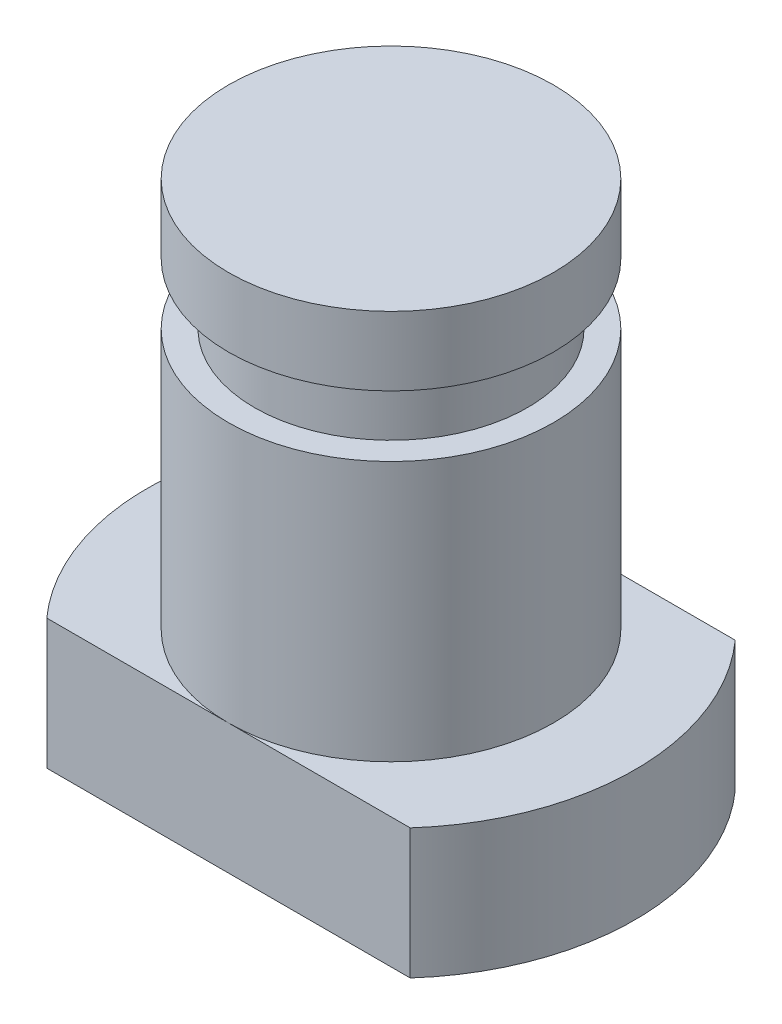
ISO-10303-21;
HEADER;
FILE_DESCRIPTION(('STEP AP214'),'2;1');
FILE_NAME('part.step','',(''),(''),'','','');
FILE_SCHEMA(('AUTOMOTIVE_DESIGN { 1 0 10303 214 1 1 1 1 }'));
ENDSEC;
DATA;
#1=APPLICATION_CONTEXT('core data for automotive mechanical design processes');
#2=APPLICATION_PROTOCOL_DEFINITION('international standard','automotive_design',2000,#1);
#3=PRODUCT_CONTEXT('',#1,'mechanical');
#4=PRODUCT('Part','Part','',(#3));
#5=PRODUCT_RELATED_PRODUCT_CATEGORY('part','',(#4));
#6=PRODUCT_DEFINITION_FORMATION('','',#4);
#7=PRODUCT_DEFINITION_CONTEXT('part definition',#1,'design');
#8=PRODUCT_DEFINITION('design','',#6,#7);
#9=PRODUCT_DEFINITION_SHAPE('','',#8);
#10=(LENGTH_UNIT() NAMED_UNIT(*) SI_UNIT(.MILLI.,.METRE.));
#11=(NAMED_UNIT(*) PLANE_ANGLE_UNIT() SI_UNIT($,.RADIAN.));
#12=(NAMED_UNIT(*) SI_UNIT($,.STERADIAN.) SOLID_ANGLE_UNIT());
#13=UNCERTAINTY_MEASURE_WITH_UNIT(LENGTH_MEASURE(1.E-05),#10,'distance_accuracy_value','');
#14=(GEOMETRIC_REPRESENTATION_CONTEXT(3) GLOBAL_UNCERTAINTY_ASSIGNED_CONTEXT((#13)) GLOBAL_UNIT_ASSIGNED_CONTEXT((#10,
#11,#12)) REPRESENTATION_CONTEXT('',''));
#15=CARTESIAN_POINT('',(0.,0.,0.));
#16=DIRECTION('',(0.,0.,1.));
#17=DIRECTION('',(1.,0.,0.));
#18=AXIS2_PLACEMENT_3D('',#15,#16,#17);
#19=CARTESIAN_POINT('',(0.,7.62,0.));
#20=DIRECTION('',(0.,-1.,0.));
#21=DIRECTION('',(0.,0.,-1.));
#22=AXIS2_PLACEMENT_3D('',#19,#20,#21);
#23=CYLINDRICAL_SURFACE('',#22,3.175);
#24=CARTESIAN_POINT('',(0.,0.,0.));
#25=DIRECTION('',(0.,1.,0.));
#26=DIRECTION('',(0.,0.,1.));
#27=AXIS2_PLACEMENT_3D('',#24,#25,#26);
#28=CIRCLE('',#27,3.175);
#29=CARTESIAN_POINT('',(0.,0.,3.175));
#30=VERTEX_POINT('',#29);
#31=CARTESIAN_POINT('',(0.,0.,-3.175));
#32=VERTEX_POINT('',#31);
#33=EDGE_CURVE('E73',#30,#32,#28,.T.);
#34=ORIENTED_EDGE('',*,*,#33,.T.);
#35=EDGE_CURVE('E86',#32,#30,#28,.T.);
#36=ORIENTED_EDGE('',*,*,#35,.T.);
#37=EDGE_LOOP('',(#34,#36));
#38=FACE_BOUND('',#37,.T.);
#39=CARTESIAN_POINT('',(0.,5.08,0.));
#40=DIRECTION('',(0.,1.,0.));
#41=DIRECTION('',(0.,0.,1.));
#42=AXIS2_PLACEMENT_3D('',#39,#40,#41);
#43=CIRCLE('',#42,3.175);
#44=CARTESIAN_POINT('',(0.,5.08,3.175));
#45=VERTEX_POINT('',#44);
#46=EDGE_CURVE('E151',#45,#45,#43,.T.);
#47=ORIENTED_EDGE('',*,*,#46,.F.);
#48=EDGE_LOOP('',(#47));
#49=FACE_BOUND('',#48,.T.);
#50=ADVANCED_FACE('F64',(#38,#49),#23,.T.);
#51=CARTESIAN_POINT('',(0.,0.,0.));
#52=DIRECTION('',(0.,-1.,0.));
#53=DIRECTION('',(0.,0.,-1.));
#54=AXIS2_PLACEMENT_3D('',#51,#52,#53);
#55=PLANE('',#54);
#56=ORIENTED_EDGE('',*,*,#33,.F.);
#57=DIRECTION('',(1.,0.,0.));
#58=VECTOR('',#57,1.);
#59=CARTESIAN_POINT('',(0.,0.,3.175));
#60=LINE('',#59,#58);
#61=CARTESIAN_POINT('',(3.54975791428092,0.,3.175));
#62=VERTEX_POINT('',#61);
#63=EDGE_CURVE('E169',#30,#62,#60,.T.);
#64=ORIENTED_EDGE('',*,*,#63,.T.);
#65=CARTESIAN_POINT('',(0.,0.,0.));
#66=DIRECTION('',(0.,-1.,0.));
#67=DIRECTION('',(0.,0.,-1.));
#68=AXIS2_PLACEMENT_3D('',#65,#66,#67);
#69=CIRCLE('',#68,4.7625);
#70=CARTESIAN_POINT('',(3.54975791428092,0.,-3.175));
#71=VERTEX_POINT('',#70);
#72=EDGE_CURVE('E168',#71,#62,#69,.T.);
#73=ORIENTED_EDGE('',*,*,#72,.F.);
#74=DIRECTION('',(1.,0.,0.));
#75=VECTOR('',#74,1.);
#76=CARTESIAN_POINT('',(0.,0.,-3.175));
#77=LINE('',#76,#75);
#78=EDGE_CURVE('E135',#32,#71,#77,.T.);
#79=ORIENTED_EDGE('',*,*,#78,.F.);
#80=EDGE_LOOP('',(#56,#64,#73,#79));
#81=FACE_BOUND('',#80,.T.);
#82=ADVANCED_FACE('F172',(#81),#55,.F.);
#83=CARTESIAN_POINT('',(0.,-2.54,3.175));
#84=DIRECTION('',(0.,0.,1.));
#85=DIRECTION('',(1.,0.,0.));
#86=AXIS2_PLACEMENT_3D('',#83,#84,#85);
#87=PLANE('',#86);
#88=CARTESIAN_POINT('',(-3.54975791428092,0.,3.175));
#89=VERTEX_POINT('',#88);
#90=EDGE_CURVE('E81',#89,#30,#60,.T.);
#91=ORIENTED_EDGE('',*,*,#90,.F.);
#92=DIRECTION('',(0.,1.,0.));
#93=VECTOR('',#92,1.);
#94=CARTESIAN_POINT('',(-3.54975791428092,-2.54,3.175));
#95=LINE('',#94,#93);
#96=CARTESIAN_POINT('',(-3.54975791428092,-2.54,3.175));
#97=VERTEX_POINT('',#96);
#98=EDGE_CURVE('E143',#97,#89,#95,.T.);
#99=ORIENTED_EDGE('',*,*,#98,.F.);
#100=DIRECTION('',(1.,0.,0.));
#101=VECTOR('',#100,1.);
#102=CARTESIAN_POINT('',(0.,-2.54,3.175));
#103=LINE('',#102,#101);
#104=CARTESIAN_POINT('',(3.54975791428092,-2.54,3.175));
#105=VERTEX_POINT('',#104);
#106=EDGE_CURVE('E122',#97,#105,#103,.T.);
#107=ORIENTED_EDGE('',*,*,#106,.T.);
#108=DIRECTION('',(0.,1.,0.));
#109=VECTOR('',#108,1.);
#110=CARTESIAN_POINT('',(3.54975791428092,-2.54,3.175));
#111=LINE('',#110,#109);
#112=EDGE_CURVE('E119',#105,#62,#111,.T.);
#113=ORIENTED_EDGE('',*,*,#112,.T.);
#114=ORIENTED_EDGE('',*,*,#63,.F.);
#115=EDGE_LOOP('',(#91,#99,#107,#113,#114));
#116=FACE_BOUND('',#115,.T.);
#117=ADVANCED_FACE('F174',(#116),#87,.T.);
#118=ORIENTED_EDGE('',*,*,#35,.F.);
#119=CARTESIAN_POINT('',(-3.54975791428092,0.,-3.175));
#120=VERTEX_POINT('',#119);
#121=EDGE_CURVE('E166',#120,#32,#77,.T.);
#122=ORIENTED_EDGE('',*,*,#121,.F.);
#123=CARTESIAN_POINT('',(0.,0.,0.));
#124=DIRECTION('',(0.,-1.,0.));
#125=DIRECTION('',(0.,0.,-1.));
#126=AXIS2_PLACEMENT_3D('',#123,#124,#125);
#127=CIRCLE('',#126,4.7625);
#128=EDGE_CURVE('E144',#89,#120,#127,.T.);
#129=ORIENTED_EDGE('',*,*,#128,.F.);
#130=ORIENTED_EDGE('',*,*,#90,.T.);
#131=EDGE_LOOP('',(#118,#122,#129,#130));
#132=FACE_BOUND('',#131,.T.);
#133=ADVANCED_FACE('F185',(#132),#55,.F.);
#134=CARTESIAN_POINT('',(0.,-2.54,0.));
#135=DIRECTION('',(0.,1.,0.));
#136=DIRECTION('',(0.,0.,1.));
#137=AXIS2_PLACEMENT_3D('',#134,#135,#136);
#138=CYLINDRICAL_SURFACE('',#137,4.7625);
#139=ORIENTED_EDGE('',*,*,#72,.T.);
#140=ORIENTED_EDGE('',*,*,#112,.F.);
#141=CARTESIAN_POINT('',(0.,-2.54,0.));
#142=DIRECTION('',(0.,-1.,0.));
#143=DIRECTION('',(0.,0.,-1.));
#144=AXIS2_PLACEMENT_3D('',#141,#142,#143);
#145=CIRCLE('',#144,4.7625);
#146=CARTESIAN_POINT('',(3.54975791428092,-2.54,-3.175));
#147=VERTEX_POINT('',#146);
#148=EDGE_CURVE('E112',#147,#105,#145,.T.);
#149=ORIENTED_EDGE('',*,*,#148,.F.);
#150=DIRECTION('',(0.,1.,0.));
#151=VECTOR('',#150,1.);
#152=CARTESIAN_POINT('',(3.54975791428092,-2.54,-3.175));
#153=LINE('',#152,#151);
#154=EDGE_CURVE('E117',#147,#71,#153,.T.);
#155=ORIENTED_EDGE('',*,*,#154,.T.);
#156=EDGE_LOOP('',(#139,#140,#149,#155));
#157=FACE_BOUND('',#156,.T.);
#158=ADVANCED_FACE('F115',(#157),#138,.T.);
#159=CARTESIAN_POINT('',(0.,-2.54,-3.175));
#160=DIRECTION('',(0.,0.,1.));
#161=DIRECTION('',(1.,0.,0.));
#162=AXIS2_PLACEMENT_3D('',#159,#160,#161);
#163=PLANE('',#162);
#164=ORIENTED_EDGE('',*,*,#121,.T.);
#165=ORIENTED_EDGE('',*,*,#78,.T.);
#166=ORIENTED_EDGE('',*,*,#154,.F.);
#167=DIRECTION('',(1.,0.,0.));
#168=VECTOR('',#167,1.);
#169=CARTESIAN_POINT('',(0.,-2.54,-3.175));
#170=LINE('',#169,#168);
#171=CARTESIAN_POINT('',(-3.54975791428092,-2.54,-3.175));
#172=VERTEX_POINT('',#171);
#173=EDGE_CURVE('E123',#172,#147,#170,.T.);
#174=ORIENTED_EDGE('',*,*,#173,.F.);
#175=DIRECTION('',(0.,1.,0.));
#176=VECTOR('',#175,1.);
#177=CARTESIAN_POINT('',(-3.54975791428092,-2.54,-3.175));
#178=LINE('',#177,#176);
#179=EDGE_CURVE('E149',#172,#120,#178,.T.);
#180=ORIENTED_EDGE('',*,*,#179,.T.);
#181=EDGE_LOOP('',(#164,#165,#166,#174,#180));
#182=FACE_BOUND('',#181,.T.);
#183=ADVANCED_FACE('F134',(#182),#163,.F.);
#184=CARTESIAN_POINT('',(0.,-2.54,0.));
#185=DIRECTION('',(0.,-1.,0.));
#186=DIRECTION('',(0.,0.,-1.));
#187=AXIS2_PLACEMENT_3D('',#184,#185,#186);
#188=PLANE('',#187);
#189=ORIENTED_EDGE('',*,*,#173,.T.);
#190=ORIENTED_EDGE('',*,*,#148,.T.);
#191=ORIENTED_EDGE('',*,*,#106,.F.);
#192=CARTESIAN_POINT('',(0.,-2.54,0.));
#193=DIRECTION('',(0.,-1.,0.));
#194=DIRECTION('',(0.,0.,-1.));
#195=AXIS2_PLACEMENT_3D('',#192,#193,#194);
#196=CIRCLE('',#195,4.7625);
#197=EDGE_CURVE('E128',#97,#172,#196,.T.);
#198=ORIENTED_EDGE('',*,*,#197,.T.);
#199=EDGE_LOOP('',(#189,#190,#191,#198));
#200=FACE_BOUND('',#199,.T.);
#201=ADVANCED_FACE('F126',(#200),#188,.T.);
#202=CARTESIAN_POINT('',(0.,-2.54,0.));
#203=DIRECTION('',(0.,1.,0.));
#204=DIRECTION('',(0.,0.,1.));
#205=AXIS2_PLACEMENT_3D('',#202,#203,#204);
#206=CYLINDRICAL_SURFACE('',#205,4.7625);
#207=ORIENTED_EDGE('',*,*,#128,.T.);
#208=ORIENTED_EDGE('',*,*,#179,.F.);
#209=ORIENTED_EDGE('',*,*,#197,.F.);
#210=ORIENTED_EDGE('',*,*,#98,.T.);
#211=EDGE_LOOP('',(#207,#208,#209,#210));
#212=FACE_BOUND('',#211,.T.);
#213=ADVANCED_FACE('F177',(#212),#206,.T.);
#214=CARTESIAN_POINT('',(0.,6.2738,0.));
#215=DIRECTION('',(0.,1.,0.));
#216=DIRECTION('',(0.,0.,1.));
#217=AXIS2_PLACEMENT_3D('',#214,#215,#216);
#218=PLANE('',#217);
#219=CARTESIAN_POINT('',(0.,6.2738,0.));
#220=DIRECTION('',(0.,1.,0.));
#221=DIRECTION('',(0.,0.,1.));
#222=AXIS2_PLACEMENT_3D('',#219,#220,#221);
#223=CIRCLE('',#222,2.667);
#224=CARTESIAN_POINT('',(0.,6.2738,2.667));
#225=VERTEX_POINT('',#224);
#226=EDGE_CURVE('E153',#225,#225,#223,.T.);
#227=ORIENTED_EDGE('',*,*,#226,.T.);
#228=EDGE_LOOP('',(#227));
#229=FACE_BOUND('',#228,.T.);
#230=CARTESIAN_POINT('',(0.,6.2738,0.));
#231=DIRECTION('',(0.,1.,0.));
#232=DIRECTION('',(0.,0.,1.));
#233=AXIS2_PLACEMENT_3D('',#230,#231,#232);
#234=CIRCLE('',#233,3.175);
#235=CARTESIAN_POINT('',(0.,6.2738,-3.175));
#236=VERTEX_POINT('',#235);
#237=EDGE_CURVE('E68',#236,#236,#234,.T.);
#238=ORIENTED_EDGE('',*,*,#237,.F.);
#239=EDGE_LOOP('',(#238));
#240=FACE_BOUND('',#239,.T.);
#241=ADVANCED_FACE('F198',(#229,#240),#218,.F.);
#242=CARTESIAN_POINT('',(0.,5.08,0.));
#243=DIRECTION('',(0.,1.,0.));
#244=DIRECTION('',(0.,0.,1.));
#245=AXIS2_PLACEMENT_3D('',#242,#243,#244);
#246=PLANE('',#245);
#247=CARTESIAN_POINT('',(0.,5.08,0.));
#248=DIRECTION('',(0.,1.,0.));
#249=DIRECTION('',(0.,0.,1.));
#250=AXIS2_PLACEMENT_3D('',#247,#248,#249);
#251=CIRCLE('',#250,2.667);
#252=CARTESIAN_POINT('',(0.,5.08,2.667));
#253=VERTEX_POINT('',#252);
#254=EDGE_CURVE('E158',#253,#253,#251,.T.);
#255=ORIENTED_EDGE('',*,*,#254,.F.);
#256=EDGE_LOOP('',(#255));
#257=FACE_BOUND('',#256,.T.);
#258=ORIENTED_EDGE('',*,*,#46,.T.);
#259=EDGE_LOOP('',(#258));
#260=FACE_BOUND('',#259,.T.);
#261=ADVANCED_FACE('F200',(#257,#260),#246,.T.);
#262=CARTESIAN_POINT('',(0.,6.2738,0.));
#263=DIRECTION('',(0.,-1.,0.));
#264=DIRECTION('',(0.,0.,-1.));
#265=AXIS2_PLACEMENT_3D('',#262,#263,#264);
#266=CYLINDRICAL_SURFACE('',#265,2.667);
#267=ORIENTED_EDGE('',*,*,#226,.F.);
#268=EDGE_LOOP('',(#267));
#269=FACE_BOUND('',#268,.T.);
#270=ORIENTED_EDGE('',*,*,#254,.T.);
#271=EDGE_LOOP('',(#270));
#272=FACE_BOUND('',#271,.T.);
#273=ADVANCED_FACE('F192',(#269,#272),#266,.T.);
#274=CARTESIAN_POINT('',(0.,7.62,0.));
#275=DIRECTION('',(0.,1.,0.));
#276=DIRECTION('',(0.,0.,1.));
#277=AXIS2_PLACEMENT_3D('',#274,#275,#276);
#278=PLANE('',#277);
#279=CARTESIAN_POINT('',(0.,7.62,0.));
#280=DIRECTION('',(0.,1.,0.));
#281=DIRECTION('',(0.,0.,1.));
#282=AXIS2_PLACEMENT_3D('',#279,#280,#281);
#283=CIRCLE('',#282,3.175);
#284=CARTESIAN_POINT('',(0.,7.62,-3.175));
#285=VERTEX_POINT('',#284);
#286=EDGE_CURVE('E13',#285,#285,#283,.T.);
#287=ORIENTED_EDGE('',*,*,#286,.T.);
#288=EDGE_LOOP('',(#287));
#289=FACE_BOUND('',#288,.T.);
#290=ADVANCED_FACE('F187',(#289),#278,.T.);
#291=CARTESIAN_POINT('',(0.,6.2738,-3.175));
#292=CARTESIAN_POINT('',(0.,6.28782291666667,-3.175));
#293=CARTESIAN_POINT('',(0.,6.30184583333333,-3.175));
#294=CARTESIAN_POINT('',(0.,6.32989166666667,-3.175));
#295=CARTESIAN_POINT('',(0.,6.34391458333333,-3.175));
#296=CARTESIAN_POINT('',(0.,6.37196041666667,-3.175));
#297=CARTESIAN_POINT('',(0.,6.38598333333333,-3.175));
#298=CARTESIAN_POINT('',(0.,6.41402916666667,-3.175));
#299=CARTESIAN_POINT('',(0.,6.42805208333333,-3.175));
#300=CARTESIAN_POINT('',(0.,6.45609791666667,-3.175));
#301=CARTESIAN_POINT('',(0.,6.47012083333333,-3.175));
#302=CARTESIAN_POINT('',(0.,6.49816666666667,-3.175));
#303=CARTESIAN_POINT('',(0.,6.51218958333333,-3.175));
#304=CARTESIAN_POINT('',(0.,6.54023541666667,-3.175));
#305=CARTESIAN_POINT('',(0.,6.55425833333333,-3.175));
#306=CARTESIAN_POINT('',(0.,6.58230416666667,-3.175));
#307=CARTESIAN_POINT('',(0.,6.59632708333333,-3.175));
#308=CARTESIAN_POINT('',(0.,6.62437291666667,-3.175));
#309=CARTESIAN_POINT('',(0.,6.63839583333333,-3.175));
#310=CARTESIAN_POINT('',(0.,6.66644166666667,-3.175));
#311=CARTESIAN_POINT('',(0.,6.68046458333333,-3.175));
#312=CARTESIAN_POINT('',(0.,6.70851041666667,-3.175));
#313=CARTESIAN_POINT('',(0.,6.72253333333333,-3.175));
#314=CARTESIAN_POINT('',(0.,6.75057916666667,-3.175));
#315=CARTESIAN_POINT('',(0.,6.76460208333333,-3.175));
#316=CARTESIAN_POINT('',(0.,6.79264791666667,-3.175));
#317=CARTESIAN_POINT('',(0.,6.80667083333333,-3.175));
#318=CARTESIAN_POINT('',(0.,6.83471666666667,-3.175));
#319=CARTESIAN_POINT('',(0.,6.84873958333333,-3.175));
#320=CARTESIAN_POINT('',(0.,6.87678541666667,-3.175));
#321=CARTESIAN_POINT('',(0.,6.89080833333333,-3.175));
#322=CARTESIAN_POINT('',(0.,6.91885416666667,-3.175));
#323=CARTESIAN_POINT('',(0.,6.93287708333333,-3.175));
#324=CARTESIAN_POINT('',(0.,6.96092291666667,-3.175));
#325=CARTESIAN_POINT('',(0.,6.97494583333333,-3.175));
#326=CARTESIAN_POINT('',(0.,7.00299166666667,-3.175));
#327=CARTESIAN_POINT('',(0.,7.01701458333333,-3.175));
#328=CARTESIAN_POINT('',(0.,7.04506041666667,-3.175));
#329=CARTESIAN_POINT('',(0.,7.05908333333333,-3.175));
#330=CARTESIAN_POINT('',(0.,7.08712916666667,-3.175));
#331=CARTESIAN_POINT('',(0.,7.10115208333333,-3.175));
#332=CARTESIAN_POINT('',(0.,7.12919791666667,-3.175));
#333=CARTESIAN_POINT('',(0.,7.14322083333333,-3.175));
#334=CARTESIAN_POINT('',(0.,7.17126666666667,-3.175));
#335=CARTESIAN_POINT('',(0.,7.18528958333333,-3.175));
#336=CARTESIAN_POINT('',(0.,7.21333541666667,-3.175));
#337=CARTESIAN_POINT('',(0.,7.22735833333333,-3.175));
#338=CARTESIAN_POINT('',(0.,7.25540416666667,-3.175));
#339=CARTESIAN_POINT('',(0.,7.26942708333333,-3.175));
#340=CARTESIAN_POINT('',(0.,7.29747291666667,-3.175));
#341=CARTESIAN_POINT('',(0.,7.31149583333333,-3.175));
#342=CARTESIAN_POINT('',(0.,7.33954166666667,-3.175));
#343=CARTESIAN_POINT('',(0.,7.35356458333333,-3.175));
#344=CARTESIAN_POINT('',(0.,7.38161041666667,-3.175));
#345=CARTESIAN_POINT('',(0.,7.39563333333333,-3.175));
#346=CARTESIAN_POINT('',(0.,7.42367916666667,-3.175));
#347=CARTESIAN_POINT('',(0.,7.43770208333333,-3.175));
#348=CARTESIAN_POINT('',(0.,7.46574791666667,-3.175));
#349=CARTESIAN_POINT('',(0.,7.47977083333333,-3.175));
#350=CARTESIAN_POINT('',(0.,7.50781666666667,-3.175));
#351=CARTESIAN_POINT('',(0.,7.52183958333333,-3.175));
#352=CARTESIAN_POINT('',(0.,7.54988541666667,-3.175));
#353=CARTESIAN_POINT('',(0.,7.56390833333333,-3.175));
#354=CARTESIAN_POINT('',(0.,7.59195416666667,-3.175));
#355=CARTESIAN_POINT('',(0.,7.60597708333333,-3.175));
#356=CARTESIAN_POINT('',(0.,7.62,-3.175));
#357=B_SPLINE_CURVE_WITH_KNOTS('',3,(#291,#292,#293,#294,#295,#296,#297,#298,#299,#300,#301,
#302,#303,#304,#305,#306,#307,#308,#309,#310,#311,#312,#313,#314,#315,#316,#317,#318,#319,#320,
#321,#322,#323,#324,#325,#326,#327,#328,#329,#330,#331,#332,#333,#334,#335,#336,#337,#338,#339,
#340,#341,#342,#343,#344,#345,#346,#347,#348,#349,#350,#351,#352,#353,#354,#355,#356),
.UNSPECIFIED.,.F.,.F.,(4,2,2,2,2,2,2,2,2,2,2,2,2,2,2,2,2,2,2,2,2,2,2,2,2,2,2,2,2,2,2,2,4),(0.,
0.0420687499999997,0.0841374999999995,0.126206249999999,0.168275,0.21034375,0.252412499999999,
0.29448125,0.33655,0.378618749999999,0.420687499999999,0.462756249999999,0.504825,
0.546893749999999,0.588962499999999,0.631031249999999,0.673099999999999,0.715168749999999,
0.757237499999999,0.799306249999999,0.841374999999999,0.883443749999999,0.925512499999999,
0.967581249999999,1.00965,1.05171875,1.0937875,1.13585625,1.177925,1.21999375,1.2620625,
1.30413125,1.3462),.UNSPECIFIED.);
#358=EDGE_CURVE('BSEAM66',#236,#285,#357,.T.);
#359=ORIENTED_EDGE('',*,*,#237,.T.);
#360=ORIENTED_EDGE('',*,*,#286,.F.);
#361=ORIENTED_EDGE('',*,*,#358,.T.);
#362=ORIENTED_EDGE('',*,*,#358,.F.);
#363=EDGE_LOOP('',(#359,#361,#360,#362));
#364=FACE_BOUND('',#363,.T.);
#365=ADVANCED_FACE('F66',(#364),#23,.T.);
#366=CLOSED_SHELL('',(#50,#82,#117,#133,#158,#183,#201,#213,#241,#261,#273,#290,#365));
#367=MANIFOLD_SOLID_BREP('B2',#366);
#368=ADVANCED_BREP_SHAPE_REPRESENTATION('',(#18,#367),#14);
#369=SHAPE_DEFINITION_REPRESENTATION(#9,#368);
ENDSEC;
END-ISO-10303-21;
